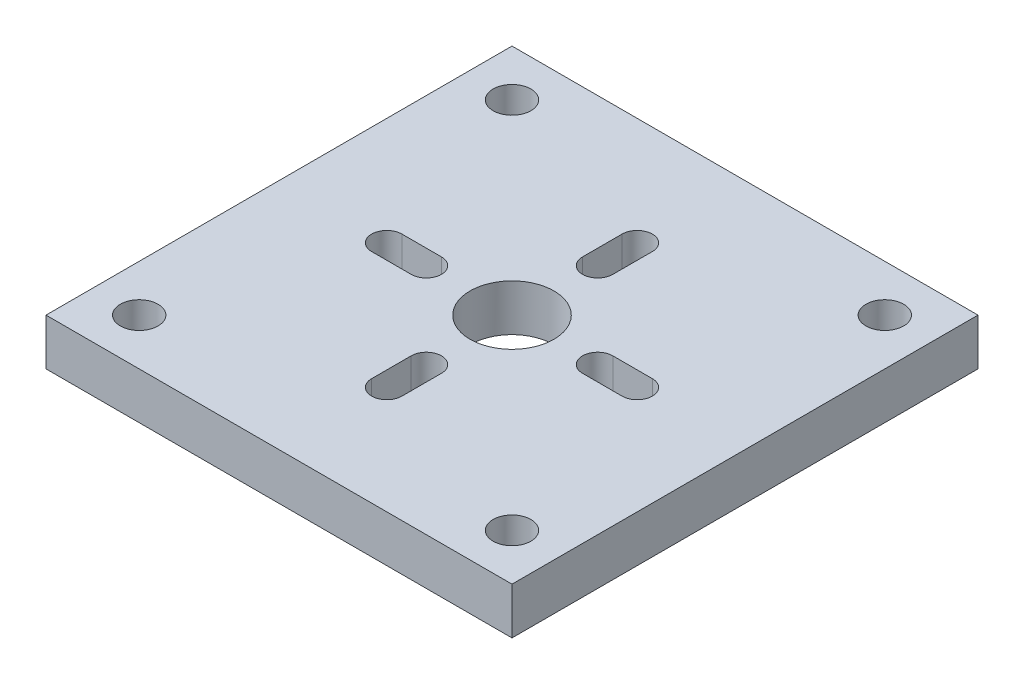
ISO-10303-21;
HEADER;
FILE_DESCRIPTION(('STEP AP214'),'2;1');
FILE_NAME('part.step','',(''),(''),'','','');
FILE_SCHEMA(('AUTOMOTIVE_DESIGN { 1 0 10303 214 1 1 1 1 }'));
ENDSEC;
DATA;
#1=APPLICATION_CONTEXT('core data for automotive mechanical design processes');
#2=APPLICATION_PROTOCOL_DEFINITION('international standard','automotive_design',2000,#1);
#3=PRODUCT_CONTEXT('',#1,'mechanical');
#4=PRODUCT('Part','Part','',(#3));
#5=PRODUCT_RELATED_PRODUCT_CATEGORY('part','',(#4));
#6=PRODUCT_DEFINITION_FORMATION('','',#4);
#7=PRODUCT_DEFINITION_CONTEXT('part definition',#1,'design');
#8=PRODUCT_DEFINITION('design','',#6,#7);
#9=PRODUCT_DEFINITION_SHAPE('','',#8);
#10=(LENGTH_UNIT() NAMED_UNIT(*) SI_UNIT(.MILLI.,.METRE.));
#11=(NAMED_UNIT(*) PLANE_ANGLE_UNIT() SI_UNIT($,.RADIAN.));
#12=(NAMED_UNIT(*) SI_UNIT($,.STERADIAN.) SOLID_ANGLE_UNIT());
#13=UNCERTAINTY_MEASURE_WITH_UNIT(LENGTH_MEASURE(1.E-05),#10,'distance_accuracy_value','');
#14=(GEOMETRIC_REPRESENTATION_CONTEXT(3) GLOBAL_UNCERTAINTY_ASSIGNED_CONTEXT((#13)) GLOBAL_UNIT_ASSIGNED_CONTEXT((#10,
#11,#12)) REPRESENTATION_CONTEXT('',''));
#15=CARTESIAN_POINT('',(0.,0.,0.));
#16=DIRECTION('',(0.,0.,1.));
#17=DIRECTION('',(1.,0.,0.));
#18=AXIS2_PLACEMENT_3D('',#15,#16,#17);
#19=CARTESIAN_POINT('',(50.,10.,-50.));
#20=DIRECTION('',(1.,0.,0.));
#21=DIRECTION('',(0.,0.,-1.));
#22=AXIS2_PLACEMENT_3D('',#19,#20,#21);
#23=PLANE('',#22);
#24=DIRECTION('',(0.,0.,1.));
#25=VECTOR('',#24,1.);
#26=CARTESIAN_POINT('',(50.,0.,-50.));
#27=LINE('',#26,#25);
#28=CARTESIAN_POINT('',(50.,0.,-50.));
#29=VERTEX_POINT('',#28);
#30=CARTESIAN_POINT('',(50.,0.,50.));
#31=VERTEX_POINT('',#30);
#32=EDGE_CURVE('E323',#29,#31,#27,.T.);
#33=ORIENTED_EDGE('',*,*,#32,.F.);
#34=DIRECTION('',(0.,-1.,0.));
#35=VECTOR('',#34,1.);
#36=CARTESIAN_POINT('',(50.,10.,-50.));
#37=LINE('',#36,#35);
#38=CARTESIAN_POINT('',(50.,10.,-50.));
#39=VERTEX_POINT('',#38);
#40=EDGE_CURVE('E11',#39,#29,#37,.T.);
#41=ORIENTED_EDGE('',*,*,#40,.F.);
#42=DIRECTION('',(0.,0.,1.));
#43=VECTOR('',#42,1.);
#44=CARTESIAN_POINT('',(50.,10.,-50.));
#45=LINE('',#44,#43);
#46=CARTESIAN_POINT('',(50.,10.,50.));
#47=VERTEX_POINT('',#46);
#48=EDGE_CURVE('E311',#39,#47,#45,.T.);
#49=ORIENTED_EDGE('',*,*,#48,.T.);
#50=DIRECTION('',(0.,-1.,0.));
#51=VECTOR('',#50,1.);
#52=CARTESIAN_POINT('',(50.,10.,50.));
#53=LINE('',#52,#51);
#54=EDGE_CURVE('E322',#47,#31,#53,.T.);
#55=ORIENTED_EDGE('',*,*,#54,.T.);
#56=EDGE_LOOP('',(#33,#41,#49,#55));
#57=FACE_BOUND('',#56,.T.);
#58=ADVANCED_FACE('F37',(#57),#23,.T.);
#59=CARTESIAN_POINT('',(50.,10.,-50.));
#60=DIRECTION('',(0.,0.,1.));
#61=DIRECTION('',(1.,0.,0.));
#62=AXIS2_PLACEMENT_3D('',#59,#60,#61);
#63=PLANE('',#62);
#64=DIRECTION('',(-1.,0.,0.));
#65=VECTOR('',#64,1.);
#66=CARTESIAN_POINT('',(50.,0.,-50.));
#67=LINE('',#66,#65);
#68=CARTESIAN_POINT('',(-50.,0.,-50.));
#69=VERTEX_POINT('',#68);
#70=EDGE_CURVE('E315',#29,#69,#67,.T.);
#71=ORIENTED_EDGE('',*,*,#70,.T.);
#72=DIRECTION('',(0.,-1.,0.));
#73=VECTOR('',#72,1.);
#74=CARTESIAN_POINT('',(-50.,10.,-50.));
#75=LINE('',#74,#73);
#76=CARTESIAN_POINT('',(-50.,10.,-50.));
#77=VERTEX_POINT('',#76);
#78=EDGE_CURVE('E45',#77,#69,#75,.T.);
#79=ORIENTED_EDGE('',*,*,#78,.F.);
#80=DIRECTION('',(-1.,0.,0.));
#81=VECTOR('',#80,1.);
#82=CARTESIAN_POINT('',(50.,10.,-50.));
#83=LINE('',#82,#81);
#84=EDGE_CURVE('E320',#39,#77,#83,.T.);
#85=ORIENTED_EDGE('',*,*,#84,.F.);
#86=ORIENTED_EDGE('',*,*,#40,.T.);
#87=EDGE_LOOP('',(#71,#79,#85,#86));
#88=FACE_BOUND('',#87,.T.);
#89=ADVANCED_FACE('F349',(#88),#63,.F.);
#90=CARTESIAN_POINT('',(-50.,10.,-50.));
#91=DIRECTION('',(1.,0.,0.));
#92=DIRECTION('',(0.,0.,-1.));
#93=AXIS2_PLACEMENT_3D('',#90,#91,#92);
#94=PLANE('',#93);
#95=DIRECTION('',(0.,0.,1.));
#96=VECTOR('',#95,1.);
#97=CARTESIAN_POINT('',(-50.,0.,-50.));
#98=LINE('',#97,#96);
#99=CARTESIAN_POINT('',(-50.,0.,50.));
#100=VERTEX_POINT('',#99);
#101=EDGE_CURVE('E329',#69,#100,#98,.T.);
#102=ORIENTED_EDGE('',*,*,#101,.T.);
#103=DIRECTION('',(0.,-1.,0.));
#104=VECTOR('',#103,1.);
#105=CARTESIAN_POINT('',(-50.,10.,50.));
#106=LINE('',#105,#104);
#107=CARTESIAN_POINT('',(-50.,10.,50.));
#108=VERTEX_POINT('',#107);
#109=EDGE_CURVE('E335',#108,#100,#106,.T.);
#110=ORIENTED_EDGE('',*,*,#109,.F.);
#111=DIRECTION('',(0.,0.,1.));
#112=VECTOR('',#111,1.);
#113=CARTESIAN_POINT('',(-50.,10.,-50.));
#114=LINE('',#113,#112);
#115=EDGE_CURVE('E318',#77,#108,#114,.T.);
#116=ORIENTED_EDGE('',*,*,#115,.F.);
#117=ORIENTED_EDGE('',*,*,#78,.T.);
#118=EDGE_LOOP('',(#102,#110,#116,#117));
#119=FACE_BOUND('',#118,.T.);
#120=ADVANCED_FACE('F353',(#119),#94,.F.);
#121=CARTESIAN_POINT('',(50.,10.,50.));
#122=DIRECTION('',(0.,0.,1.));
#123=DIRECTION('',(1.,0.,0.));
#124=AXIS2_PLACEMENT_3D('',#121,#122,#123);
#125=PLANE('',#124);
#126=DIRECTION('',(-1.,0.,0.));
#127=VECTOR('',#126,1.);
#128=CARTESIAN_POINT('',(50.,0.,50.));
#129=LINE('',#128,#127);
#130=EDGE_CURVE('E326',#31,#100,#129,.T.);
#131=ORIENTED_EDGE('',*,*,#130,.F.);
#132=ORIENTED_EDGE('',*,*,#54,.F.);
#133=DIRECTION('',(-1.,0.,0.));
#134=VECTOR('',#133,1.);
#135=CARTESIAN_POINT('',(50.,10.,50.));
#136=LINE('',#135,#134);
#137=EDGE_CURVE('E314',#47,#108,#136,.T.);
#138=ORIENTED_EDGE('',*,*,#137,.T.);
#139=ORIENTED_EDGE('',*,*,#109,.T.);
#140=EDGE_LOOP('',(#131,#132,#138,#139));
#141=FACE_BOUND('',#140,.T.);
#142=ADVANCED_FACE('F342',(#141),#125,.T.);
#143=CARTESIAN_POINT('',(0.,10.,0.));
#144=DIRECTION('',(0.,-1.,0.));
#145=DIRECTION('',(0.,0.,-1.));
#146=AXIS2_PLACEMENT_3D('',#143,#144,#145);
#147=PLANE('',#146);
#148=CARTESIAN_POINT('',(-40.,10.,-40.));
#149=DIRECTION('',(0.,1.,0.));
#150=DIRECTION('',(0.,0.,1.));
#151=AXIS2_PLACEMENT_3D('',#148,#149,#150);
#152=CIRCLE('',#151,4.05);
#153=CARTESIAN_POINT('',(-40.,10.,-35.95));
#154=VERTEX_POINT('',#153);
#155=EDGE_CURVE('E606',#154,#154,#152,.T.);
#156=ORIENTED_EDGE('',*,*,#155,.F.);
#157=EDGE_LOOP('',(#156));
#158=FACE_BOUND('',#157,.T.);
#159=CARTESIAN_POINT('',(40.,10.,40.));
#160=DIRECTION('',(0.,1.,0.));
#161=DIRECTION('',(0.,0.,1.));
#162=AXIS2_PLACEMENT_3D('',#159,#160,#161);
#163=CIRCLE('',#162,4.05);
#164=CARTESIAN_POINT('',(40.,10.,44.05));
#165=VERTEX_POINT('',#164);
#166=EDGE_CURVE('E611',#165,#165,#163,.T.);
#167=ORIENTED_EDGE('',*,*,#166,.F.);
#168=EDGE_LOOP('',(#167));
#169=FACE_BOUND('',#168,.T.);
#170=CARTESIAN_POINT('',(40.,10.,-40.));
#171=DIRECTION('',(0.,1.,0.));
#172=DIRECTION('',(0.,0.,1.));
#173=AXIS2_PLACEMENT_3D('',#170,#171,#172);
#174=CIRCLE('',#173,4.05);
#175=CARTESIAN_POINT('',(40.,10.,-35.95));
#176=VERTEX_POINT('',#175);
#177=EDGE_CURVE('E622',#176,#176,#174,.T.);
#178=ORIENTED_EDGE('',*,*,#177,.F.);
#179=EDGE_LOOP('',(#178));
#180=FACE_BOUND('',#179,.T.);
#181=CARTESIAN_POINT('',(-40.,10.,40.));
#182=DIRECTION('',(0.,1.,0.));
#183=DIRECTION('',(0.,0.,1.));
#184=AXIS2_PLACEMENT_3D('',#181,#182,#183);
#185=CIRCLE('',#184,4.05);
#186=CARTESIAN_POINT('',(-40.,10.,44.05));
#187=VERTEX_POINT('',#186);
#188=EDGE_CURVE('E281',#187,#187,#185,.T.);
#189=ORIENTED_EDGE('',*,*,#188,.F.);
#190=EDGE_LOOP('',(#189));
#191=FACE_BOUND('',#190,.T.);
#192=DIRECTION('',(0.,0.,-1.));
#193=VECTOR('',#192,1.);
#194=CARTESIAN_POINT('',(3.25,10.,26.8700576850888));
#195=LINE('',#194,#193);
#196=CARTESIAN_POINT('',(3.25,10.,26.8700576850888));
#197=VERTEX_POINT('',#196);
#198=CARTESIAN_POINT('',(3.25,10.,18.3847763108502));
#199=VERTEX_POINT('',#198);
#200=EDGE_CURVE('E198',#197,#199,#195,.T.);
#201=ORIENTED_EDGE('',*,*,#200,.F.);
#202=CARTESIAN_POINT('',(0.,10.,26.8700576850888));
#203=DIRECTION('',(0.,1.,0.));
#204=DIRECTION('',(0.,0.,-1.));
#205=AXIS2_PLACEMENT_3D('',#202,#203,#204);
#206=CIRCLE('',#205,3.25);
#207=CARTESIAN_POINT('',(-3.24999999999999,10.,26.8700576850888));
#208=VERTEX_POINT('',#207);
#209=EDGE_CURVE('E53',#208,#197,#206,.T.);
#210=ORIENTED_EDGE('',*,*,#209,.F.);
#211=DIRECTION('',(0.,0.,1.));
#212=VECTOR('',#211,1.);
#213=CARTESIAN_POINT('',(-3.24999999999999,10.,26.8700576850888));
#214=LINE('',#213,#212);
#215=CARTESIAN_POINT('',(-3.25,10.,18.3847763108502));
#216=VERTEX_POINT('',#215);
#217=EDGE_CURVE('E191',#216,#208,#214,.T.);
#218=ORIENTED_EDGE('',*,*,#217,.F.);
#219=CARTESIAN_POINT('',(0.,10.,18.3847763108502));
#220=DIRECTION('',(0.,1.,0.));
#221=DIRECTION('',(0.,0.,-1.));
#222=AXIS2_PLACEMENT_3D('',#219,#220,#221);
#223=CIRCLE('',#222,3.25);
#224=EDGE_CURVE('E205',#199,#216,#223,.T.);
#225=ORIENTED_EDGE('',*,*,#224,.F.);
#226=EDGE_LOOP('',(#201,#210,#218,#225));
#227=FACE_BOUND('',#226,.T.);
#228=DIRECTION('',(1.,0.,0.));
#229=VECTOR('',#228,1.);
#230=CARTESIAN_POINT('',(-26.8700576850888,10.,3.25));
#231=LINE('',#230,#229);
#232=CARTESIAN_POINT('',(-26.8700576850888,10.,3.25));
#233=VERTEX_POINT('',#232);
#234=CARTESIAN_POINT('',(-18.3847763108502,10.,3.25));
#235=VERTEX_POINT('',#234);
#236=EDGE_CURVE('E225',#233,#235,#231,.T.);
#237=ORIENTED_EDGE('',*,*,#236,.F.);
#238=CARTESIAN_POINT('',(-26.8700576850888,10.,0.));
#239=DIRECTION('',(0.,1.,0.));
#240=DIRECTION('',(0.,0.,-1.));
#241=AXIS2_PLACEMENT_3D('',#238,#239,#240);
#242=CIRCLE('',#241,3.25);
#243=CARTESIAN_POINT('',(-26.8700576850888,10.,-3.25));
#244=VERTEX_POINT('',#243);
#245=EDGE_CURVE('E61',#244,#233,#242,.T.);
#246=ORIENTED_EDGE('',*,*,#245,.F.);
#247=DIRECTION('',(-1.,0.,0.));
#248=VECTOR('',#247,1.);
#249=CARTESIAN_POINT('',(-26.8700576850888,10.,-3.25));
#250=LINE('',#249,#248);
#251=CARTESIAN_POINT('',(-18.3847763108502,10.,-3.25));
#252=VERTEX_POINT('',#251);
#253=EDGE_CURVE('E231',#252,#244,#250,.T.);
#254=ORIENTED_EDGE('',*,*,#253,.F.);
#255=CARTESIAN_POINT('',(-18.3847763108502,10.,0.));
#256=DIRECTION('',(0.,1.,0.));
#257=DIRECTION('',(0.,0.,-1.));
#258=AXIS2_PLACEMENT_3D('',#255,#256,#257);
#259=CIRCLE('',#258,3.25);
#260=EDGE_CURVE('E228',#235,#252,#259,.T.);
#261=ORIENTED_EDGE('',*,*,#260,.F.);
#262=EDGE_LOOP('',(#237,#246,#254,#261));
#263=FACE_BOUND('',#262,.T.);
#264=DIRECTION('',(0.,0.,1.));
#265=VECTOR('',#264,1.);
#266=CARTESIAN_POINT('',(-3.25,10.,-26.8700576850888));
#267=LINE('',#266,#265);
#268=CARTESIAN_POINT('',(-3.25,10.,-26.8700576850888));
#269=VERTEX_POINT('',#268);
#270=CARTESIAN_POINT('',(-3.25,10.,-18.3847763108502));
#271=VERTEX_POINT('',#270);
#272=EDGE_CURVE('E257',#269,#271,#267,.T.);
#273=ORIENTED_EDGE('',*,*,#272,.F.);
#274=CARTESIAN_POINT('',(0.,10.,-26.8700576850888));
#275=DIRECTION('',(0.,1.,0.));
#276=DIRECTION('',(0.,0.,-1.));
#277=AXIS2_PLACEMENT_3D('',#274,#275,#276);
#278=CIRCLE('',#277,3.25);
#279=CARTESIAN_POINT('',(3.25,10.,-26.8700576850888));
#280=VERTEX_POINT('',#279);
#281=EDGE_CURVE('E255',#280,#269,#278,.T.);
#282=ORIENTED_EDGE('',*,*,#281,.F.);
#283=DIRECTION('',(0.,0.,-1.));
#284=VECTOR('',#283,1.);
#285=CARTESIAN_POINT('',(3.25,10.,-26.8700576850888));
#286=LINE('',#285,#284);
#287=CARTESIAN_POINT('',(3.25,10.,-18.3847763108502));
#288=VERTEX_POINT('',#287);
#289=EDGE_CURVE('E263',#288,#280,#286,.T.);
#290=ORIENTED_EDGE('',*,*,#289,.F.);
#291=CARTESIAN_POINT('',(0.,10.,-18.3847763108502));
#292=DIRECTION('',(0.,1.,0.));
#293=DIRECTION('',(0.,0.,-1.));
#294=AXIS2_PLACEMENT_3D('',#291,#292,#293);
#295=CIRCLE('',#294,3.25);
#296=EDGE_CURVE('E260',#271,#288,#295,.T.);
#297=ORIENTED_EDGE('',*,*,#296,.F.);
#298=EDGE_LOOP('',(#273,#282,#290,#297));
#299=FACE_BOUND('',#298,.T.);
#300=DIRECTION('',(-1.,0.,0.));
#301=VECTOR('',#300,1.);
#302=CARTESIAN_POINT('',(26.8700576850888,10.,-3.25));
#303=LINE('',#302,#301);
#304=CARTESIAN_POINT('',(26.8700576850888,10.,-3.25));
#305=VERTEX_POINT('',#304);
#306=CARTESIAN_POINT('',(18.3847763108502,10.,-3.25));
#307=VERTEX_POINT('',#306);
#308=EDGE_CURVE('E289',#305,#307,#303,.T.);
#309=ORIENTED_EDGE('',*,*,#308,.F.);
#310=CARTESIAN_POINT('',(26.8700576850888,10.,0.));
#311=DIRECTION('',(0.,1.,0.));
#312=DIRECTION('',(0.,0.,-1.));
#313=AXIS2_PLACEMENT_3D('',#310,#311,#312);
#314=CIRCLE('',#313,3.25);
#315=CARTESIAN_POINT('',(26.8700576850888,10.,3.25));
#316=VERTEX_POINT('',#315);
#317=EDGE_CURVE('E287',#316,#305,#314,.T.);
#318=ORIENTED_EDGE('',*,*,#317,.F.);
#319=DIRECTION('',(1.,0.,0.));
#320=VECTOR('',#319,1.);
#321=CARTESIAN_POINT('',(26.8700576850888,10.,3.25));
#322=LINE('',#321,#320);
#323=CARTESIAN_POINT('',(18.3847763108502,10.,3.25));
#324=VERTEX_POINT('',#323);
#325=EDGE_CURVE('E295',#324,#316,#322,.T.);
#326=ORIENTED_EDGE('',*,*,#325,.F.);
#327=CARTESIAN_POINT('',(18.3847763108502,10.,0.));
#328=DIRECTION('',(0.,1.,0.));
#329=DIRECTION('',(0.,0.,-1.));
#330=AXIS2_PLACEMENT_3D('',#327,#328,#329);
#331=CIRCLE('',#330,3.25);
#332=EDGE_CURVE('E292',#307,#324,#331,.T.);
#333=ORIENTED_EDGE('',*,*,#332,.F.);
#334=EDGE_LOOP('',(#309,#318,#326,#333));
#335=FACE_BOUND('',#334,.T.);
#336=CARTESIAN_POINT('',(0.,10.,0.));
#337=DIRECTION('',(0.,1.,0.));
#338=DIRECTION('',(0.,0.,1.));
#339=AXIS2_PLACEMENT_3D('',#336,#337,#338);
#340=CIRCLE('',#339,9.);
#341=CARTESIAN_POINT('',(0.,10.,9.));
#342=VERTEX_POINT('',#341);
#343=EDGE_CURVE('E185',#342,#342,#340,.T.);
#344=ORIENTED_EDGE('',*,*,#343,.F.);
#345=EDGE_LOOP('',(#344));
#346=FACE_BOUND('',#345,.T.);
#347=ORIENTED_EDGE('',*,*,#48,.F.);
#348=ORIENTED_EDGE('',*,*,#84,.T.);
#349=ORIENTED_EDGE('',*,*,#115,.T.);
#350=ORIENTED_EDGE('',*,*,#137,.F.);
#351=EDGE_LOOP('',(#347,#348,#349,#350));
#352=FACE_BOUND('',#351,.T.);
#353=ADVANCED_FACE('F355',(#158,#169,#180,#191,#227,#263,#299,#335,#346,#352),#147,.F.);
#354=CARTESIAN_POINT('',(0.,0.,0.));
#355=DIRECTION('',(0.,-1.,0.));
#356=DIRECTION('',(0.,0.,-1.));
#357=AXIS2_PLACEMENT_3D('',#354,#355,#356);
#358=PLANE('',#357);
#359=CARTESIAN_POINT('',(-40.,0.,-40.));
#360=DIRECTION('',(0.,-1.,0.));
#361=DIRECTION('',(0.,0.,-1.));
#362=AXIS2_PLACEMENT_3D('',#359,#360,#361);
#363=CIRCLE('',#362,4.05);
#364=CARTESIAN_POINT('',(-40.,0.,-44.05));
#365=VERTEX_POINT('',#364);
#366=EDGE_CURVE('E604',#365,#365,#363,.F.);
#367=ORIENTED_EDGE('',*,*,#366,.T.);
#368=EDGE_LOOP('',(#367));
#369=FACE_BOUND('',#368,.T.);
#370=CARTESIAN_POINT('',(40.,0.,40.));
#371=DIRECTION('',(0.,-1.,0.));
#372=DIRECTION('',(0.,0.,-1.));
#373=AXIS2_PLACEMENT_3D('',#370,#371,#372);
#374=CIRCLE('',#373,4.05);
#375=CARTESIAN_POINT('',(40.,0.,35.95));
#376=VERTEX_POINT('',#375);
#377=EDGE_CURVE('E619',#376,#376,#374,.F.);
#378=ORIENTED_EDGE('',*,*,#377,.T.);
#379=EDGE_LOOP('',(#378));
#380=FACE_BOUND('',#379,.T.);
#381=CARTESIAN_POINT('',(40.,0.,-40.));
#382=DIRECTION('',(0.,-1.,0.));
#383=DIRECTION('',(0.,0.,-1.));
#384=AXIS2_PLACEMENT_3D('',#381,#382,#383);
#385=CIRCLE('',#384,4.05);
#386=CARTESIAN_POINT('',(40.,0.,-44.05));
#387=VERTEX_POINT('',#386);
#388=EDGE_CURVE('E614',#387,#387,#385,.F.);
#389=ORIENTED_EDGE('',*,*,#388,.T.);
#390=EDGE_LOOP('',(#389));
#391=FACE_BOUND('',#390,.T.);
#392=CARTESIAN_POINT('',(-40.,0.,40.));
#393=DIRECTION('',(0.,-1.,0.));
#394=DIRECTION('',(0.,0.,-1.));
#395=AXIS2_PLACEMENT_3D('',#392,#393,#394);
#396=CIRCLE('',#395,4.05);
#397=CARTESIAN_POINT('',(-40.,0.,35.95));
#398=VERTEX_POINT('',#397);
#399=EDGE_CURVE('E607',#398,#398,#396,.F.);
#400=ORIENTED_EDGE('',*,*,#399,.T.);
#401=EDGE_LOOP('',(#400));
#402=FACE_BOUND('',#401,.T.);
#403=CARTESIAN_POINT('',(0.,0.,26.8700576850888));
#404=DIRECTION('',(0.,-1.,0.));
#405=DIRECTION('',(0.,0.,-1.));
#406=AXIS2_PLACEMENT_3D('',#403,#404,#405);
#407=CIRCLE('',#406,3.25);
#408=CARTESIAN_POINT('',(-3.24999999999999,0.,26.8700576850888));
#409=VERTEX_POINT('',#408);
#410=CARTESIAN_POINT('',(3.25,0.,26.8700576850888));
#411=VERTEX_POINT('',#410);
#412=EDGE_CURVE('E189',#409,#411,#407,.F.);
#413=ORIENTED_EDGE('',*,*,#412,.T.);
#414=DIRECTION('',(0.,0.,-1.));
#415=VECTOR('',#414,1.);
#416=CARTESIAN_POINT('',(3.25,0.,26.8700576850888));
#417=LINE('',#416,#415);
#418=CARTESIAN_POINT('',(3.25,0.,18.3847763108502));
#419=VERTEX_POINT('',#418);
#420=EDGE_CURVE('E175',#411,#419,#417,.T.);
#421=ORIENTED_EDGE('',*,*,#420,.T.);
#422=CARTESIAN_POINT('',(0.,0.,18.3847763108502));
#423=DIRECTION('',(0.,-1.,0.));
#424=DIRECTION('',(0.,0.,-1.));
#425=AXIS2_PLACEMENT_3D('',#422,#423,#424);
#426=CIRCLE('',#425,3.25);
#427=CARTESIAN_POINT('',(-3.25,0.,18.3847763108502));
#428=VERTEX_POINT('',#427);
#429=EDGE_CURVE('E200',#419,#428,#426,.F.);
#430=ORIENTED_EDGE('',*,*,#429,.T.);
#431=DIRECTION('',(0.,0.,1.));
#432=VECTOR('',#431,1.);
#433=CARTESIAN_POINT('',(-3.24999999999999,0.,26.8700576850888));
#434=LINE('',#433,#432);
#435=EDGE_CURVE('E196',#428,#409,#434,.T.);
#436=ORIENTED_EDGE('',*,*,#435,.T.);
#437=EDGE_LOOP('',(#413,#421,#430,#436));
#438=FACE_BOUND('',#437,.T.);
#439=CARTESIAN_POINT('',(-26.8700576850888,0.,0.));
#440=DIRECTION('',(0.,-1.,0.));
#441=DIRECTION('',(0.,0.,-1.));
#442=AXIS2_PLACEMENT_3D('',#439,#440,#441);
#443=CIRCLE('',#442,3.25);
#444=CARTESIAN_POINT('',(-26.8700576850888,0.,-3.25));
#445=VERTEX_POINT('',#444);
#446=CARTESIAN_POINT('',(-26.8700576850888,0.,3.25));
#447=VERTEX_POINT('',#446);
#448=EDGE_CURVE('E221',#445,#447,#443,.F.);
#449=ORIENTED_EDGE('',*,*,#448,.T.);
#450=DIRECTION('',(1.,0.,0.));
#451=VECTOR('',#450,1.);
#452=CARTESIAN_POINT('',(-26.8700576850888,0.,3.25));
#453=LINE('',#452,#451);
#454=CARTESIAN_POINT('',(-18.3847763108502,0.,3.25));
#455=VERTEX_POINT('',#454);
#456=EDGE_CURVE('E237',#447,#455,#453,.T.);
#457=ORIENTED_EDGE('',*,*,#456,.T.);
#458=CARTESIAN_POINT('',(-18.3847763108502,0.,0.));
#459=DIRECTION('',(0.,-1.,0.));
#460=DIRECTION('',(0.,0.,-1.));
#461=AXIS2_PLACEMENT_3D('',#458,#459,#460);
#462=CIRCLE('',#461,3.25);
#463=CARTESIAN_POINT('',(-18.3847763108502,0.,-3.25));
#464=VERTEX_POINT('',#463);
#465=EDGE_CURVE('E214',#455,#464,#462,.F.);
#466=ORIENTED_EDGE('',*,*,#465,.T.);
#467=DIRECTION('',(-1.,0.,0.));
#468=VECTOR('',#467,1.);
#469=CARTESIAN_POINT('',(-26.8700576850888,0.,-3.25));
#470=LINE('',#469,#468);
#471=EDGE_CURVE('E217',#464,#445,#470,.T.);
#472=ORIENTED_EDGE('',*,*,#471,.T.);
#473=EDGE_LOOP('',(#449,#457,#466,#472));
#474=FACE_BOUND('',#473,.T.);
#475=CARTESIAN_POINT('',(0.,0.,-26.8700576850888));
#476=DIRECTION('',(0.,-1.,0.));
#477=DIRECTION('',(0.,0.,-1.));
#478=AXIS2_PLACEMENT_3D('',#475,#476,#477);
#479=CIRCLE('',#478,3.25);
#480=CARTESIAN_POINT('',(3.25,0.,-26.8700576850888));
#481=VERTEX_POINT('',#480);
#482=CARTESIAN_POINT('',(-3.25,0.,-26.8700576850888));
#483=VERTEX_POINT('',#482);
#484=EDGE_CURVE('E252',#481,#483,#479,.F.);
#485=ORIENTED_EDGE('',*,*,#484,.T.);
#486=DIRECTION('',(0.,0.,1.));
#487=VECTOR('',#486,1.);
#488=CARTESIAN_POINT('',(-3.25,0.,-26.8700576850888));
#489=LINE('',#488,#487);
#490=CARTESIAN_POINT('',(-3.25,0.,-18.3847763108502));
#491=VERTEX_POINT('',#490);
#492=EDGE_CURVE('E218',#483,#491,#489,.T.);
#493=ORIENTED_EDGE('',*,*,#492,.T.);
#494=CARTESIAN_POINT('',(0.,0.,-18.3847763108502));
#495=DIRECTION('',(0.,-1.,0.));
#496=DIRECTION('',(0.,0.,-1.));
#497=AXIS2_PLACEMENT_3D('',#494,#495,#496);
#498=CIRCLE('',#497,3.25);
#499=CARTESIAN_POINT('',(3.25,0.,-18.3847763108502));
#500=VERTEX_POINT('',#499);
#501=EDGE_CURVE('E245',#491,#500,#498,.F.);
#502=ORIENTED_EDGE('',*,*,#501,.T.);
#503=DIRECTION('',(0.,0.,-1.));
#504=VECTOR('',#503,1.);
#505=CARTESIAN_POINT('',(3.25,0.,-26.8700576850888));
#506=LINE('',#505,#504);
#507=EDGE_CURVE('E248',#500,#481,#506,.T.);
#508=ORIENTED_EDGE('',*,*,#507,.T.);
#509=EDGE_LOOP('',(#485,#493,#502,#508));
#510=FACE_BOUND('',#509,.T.);
#511=CARTESIAN_POINT('',(26.8700576850888,0.,0.));
#512=DIRECTION('',(0.,-1.,0.));
#513=DIRECTION('',(0.,0.,-1.));
#514=AXIS2_PLACEMENT_3D('',#511,#512,#513);
#515=CIRCLE('',#514,3.25);
#516=CARTESIAN_POINT('',(26.8700576850888,0.,3.25));
#517=VERTEX_POINT('',#516);
#518=CARTESIAN_POINT('',(26.8700576850888,0.,-3.25));
#519=VERTEX_POINT('',#518);
#520=EDGE_CURVE('E284',#517,#519,#515,.F.);
#521=ORIENTED_EDGE('',*,*,#520,.T.);
#522=DIRECTION('',(-1.,0.,0.));
#523=VECTOR('',#522,1.);
#524=CARTESIAN_POINT('',(26.8700576850888,0.,-3.25));
#525=LINE('',#524,#523);
#526=CARTESIAN_POINT('',(18.3847763108502,0.,-3.25));
#527=VERTEX_POINT('',#526);
#528=EDGE_CURVE('E249',#519,#527,#525,.T.);
#529=ORIENTED_EDGE('',*,*,#528,.T.);
#530=CARTESIAN_POINT('',(18.3847763108502,0.,0.));
#531=DIRECTION('',(0.,-1.,0.));
#532=DIRECTION('',(0.,0.,-1.));
#533=AXIS2_PLACEMENT_3D('',#530,#531,#532);
#534=CIRCLE('',#533,3.25);
#535=CARTESIAN_POINT('',(18.3847763108502,0.,3.25));
#536=VERTEX_POINT('',#535);
#537=EDGE_CURVE('E277',#527,#536,#534,.F.);
#538=ORIENTED_EDGE('',*,*,#537,.T.);
#539=DIRECTION('',(1.,0.,0.));
#540=VECTOR('',#539,1.);
#541=CARTESIAN_POINT('',(26.8700576850888,0.,3.25));
#542=LINE('',#541,#540);
#543=EDGE_CURVE('E280',#536,#517,#542,.T.);
#544=ORIENTED_EDGE('',*,*,#543,.T.);
#545=EDGE_LOOP('',(#521,#529,#538,#544));
#546=FACE_BOUND('',#545,.T.);
#547=CARTESIAN_POINT('',(0.,0.,0.));
#548=DIRECTION('',(0.,-1.,0.));
#549=DIRECTION('',(0.,0.,-1.));
#550=AXIS2_PLACEMENT_3D('',#547,#548,#549);
#551=CIRCLE('',#550,9.);
#552=CARTESIAN_POINT('',(0.,0.,-9.));
#553=VERTEX_POINT('',#552);
#554=EDGE_CURVE('E40',#553,#553,#551,.T.);
#555=ORIENTED_EDGE('',*,*,#554,.F.);
#556=EDGE_LOOP('',(#555));
#557=FACE_BOUND('',#556,.T.);
#558=ORIENTED_EDGE('',*,*,#32,.T.);
#559=ORIENTED_EDGE('',*,*,#130,.T.);
#560=ORIENTED_EDGE('',*,*,#101,.F.);
#561=ORIENTED_EDGE('',*,*,#70,.F.);
#562=EDGE_LOOP('',(#558,#559,#560,#561));
#563=FACE_BOUND('',#562,.T.);
#564=ADVANCED_FACE('F194',(#369,#380,#391,#402,#438,#474,#510,#546,#557,#563),#358,.T.);
#565=CARTESIAN_POINT('',(0.,-30.,0.));
#566=DIRECTION('',(0.,1.,0.));
#567=DIRECTION('',(0.,0.,1.));
#568=AXIS2_PLACEMENT_3D('',#565,#566,#567);
#569=CYLINDRICAL_SURFACE('',#568,9.);
#570=ORIENTED_EDGE('',*,*,#554,.T.);
#571=EDGE_LOOP('',(#570));
#572=FACE_BOUND('',#571,.T.);
#573=ORIENTED_EDGE('',*,*,#343,.T.);
#574=EDGE_LOOP('',(#573));
#575=FACE_BOUND('',#574,.T.);
#576=ADVANCED_FACE('F363',(#572,#575),#569,.F.);
#577=CARTESIAN_POINT('',(26.8700576850888,-0.000999999999999265,0.));
#578=DIRECTION('',(0.,1.,0.));
#579=DIRECTION('',(0.,0.,1.));
#580=AXIS2_PLACEMENT_3D('',#577,#578,#579);
#581=CYLINDRICAL_SURFACE('',#580,3.25);
#582=DIRECTION('',(0.,1.,0.));
#583=VECTOR('',#582,1.);
#584=CARTESIAN_POINT('',(26.8700576850888,-0.000999999999999265,3.25));
#585=LINE('',#584,#583);
#586=EDGE_CURVE('E299',#517,#316,#585,.T.);
#587=ORIENTED_EDGE('',*,*,#586,.T.);
#588=ORIENTED_EDGE('',*,*,#317,.T.);
#589=DIRECTION('',(0.,1.,0.));
#590=VECTOR('',#589,1.);
#591=CARTESIAN_POINT('',(26.8700576850888,-0.000999999999999265,-3.25));
#592=LINE('',#591,#590);
#593=EDGE_CURVE('E298',#519,#305,#592,.T.);
#594=ORIENTED_EDGE('',*,*,#593,.F.);
#595=ORIENTED_EDGE('',*,*,#520,.F.);
#596=EDGE_LOOP('',(#587,#588,#594,#595));
#597=FACE_BOUND('',#596,.T.);
#598=ADVANCED_FACE('F394',(#597),#581,.F.);
#599=CARTESIAN_POINT('',(26.8700576850888,-0.000999999999999265,3.25));
#600=DIRECTION('',(0.,0.,1.));
#601=DIRECTION('',(1.,0.,0.));
#602=AXIS2_PLACEMENT_3D('',#599,#600,#601);
#603=PLANE('',#602);
#604=DIRECTION('',(0.,1.,0.));
#605=VECTOR('',#604,1.);
#606=CARTESIAN_POINT('',(18.3847763108502,-0.000999999999999265,3.25));
#607=LINE('',#606,#605);
#608=EDGE_CURVE('E301',#536,#324,#607,.T.);
#609=ORIENTED_EDGE('',*,*,#608,.T.);
#610=ORIENTED_EDGE('',*,*,#325,.T.);
#611=ORIENTED_EDGE('',*,*,#586,.F.);
#612=ORIENTED_EDGE('',*,*,#543,.F.);
#613=EDGE_LOOP('',(#609,#610,#611,#612));
#614=FACE_BOUND('',#613,.T.);
#615=ADVANCED_FACE('F404',(#614),#603,.F.);
#616=CARTESIAN_POINT('',(18.3847763108502,-0.000999999999999265,0.));
#617=DIRECTION('',(0.,1.,0.));
#618=DIRECTION('',(0.,0.,1.));
#619=AXIS2_PLACEMENT_3D('',#616,#617,#618);
#620=CYLINDRICAL_SURFACE('',#619,3.25);
#621=DIRECTION('',(0.,1.,0.));
#622=VECTOR('',#621,1.);
#623=CARTESIAN_POINT('',(18.3847763108502,-0.000999999999999265,-3.25));
#624=LINE('',#623,#622);
#625=EDGE_CURVE('E303',#527,#307,#624,.T.);
#626=ORIENTED_EDGE('',*,*,#625,.T.);
#627=ORIENTED_EDGE('',*,*,#332,.T.);
#628=ORIENTED_EDGE('',*,*,#608,.F.);
#629=ORIENTED_EDGE('',*,*,#537,.F.);
#630=EDGE_LOOP('',(#626,#627,#628,#629));
#631=FACE_BOUND('',#630,.T.);
#632=ADVANCED_FACE('F414',(#631),#620,.F.);
#633=CARTESIAN_POINT('',(26.8700576850888,-0.000999999999999265,-3.25));
#634=DIRECTION('',(0.,0.,-1.));
#635=DIRECTION('',(-1.,0.,0.));
#636=AXIS2_PLACEMENT_3D('',#633,#634,#635);
#637=PLANE('',#636);
#638=ORIENTED_EDGE('',*,*,#593,.T.);
#639=ORIENTED_EDGE('',*,*,#308,.T.);
#640=ORIENTED_EDGE('',*,*,#625,.F.);
#641=ORIENTED_EDGE('',*,*,#528,.F.);
#642=EDGE_LOOP('',(#638,#639,#640,#641));
#643=FACE_BOUND('',#642,.T.);
#644=ADVANCED_FACE('F424',(#643),#637,.F.);
#645=CARTESIAN_POINT('',(0.,-0.000999999999999265,-26.8700576850888));
#646=DIRECTION('',(0.,1.,0.));
#647=DIRECTION('',(0.,0.,1.));
#648=AXIS2_PLACEMENT_3D('',#645,#646,#647);
#649=CYLINDRICAL_SURFACE('',#648,3.25);
#650=DIRECTION('',(0.,1.,0.));
#651=VECTOR('',#650,1.);
#652=CARTESIAN_POINT('',(3.25,-0.000999999999999265,-26.8700576850888));
#653=LINE('',#652,#651);
#654=EDGE_CURVE('E267',#481,#280,#653,.T.);
#655=ORIENTED_EDGE('',*,*,#654,.T.);
#656=ORIENTED_EDGE('',*,*,#281,.T.);
#657=DIRECTION('',(0.,1.,0.));
#658=VECTOR('',#657,1.);
#659=CARTESIAN_POINT('',(-3.25,-0.000999999999999265,-26.8700576850888));
#660=LINE('',#659,#658);
#661=EDGE_CURVE('E266',#483,#269,#660,.T.);
#662=ORIENTED_EDGE('',*,*,#661,.F.);
#663=ORIENTED_EDGE('',*,*,#484,.F.);
#664=EDGE_LOOP('',(#655,#656,#662,#663));
#665=FACE_BOUND('',#664,.T.);
#666=ADVANCED_FACE('F434',(#665),#649,.F.);
#667=CARTESIAN_POINT('',(3.25,-0.000999999999999265,-26.8700576850888));
#668=DIRECTION('',(1.,0.,0.));
#669=DIRECTION('',(0.,0.,-1.));
#670=AXIS2_PLACEMENT_3D('',#667,#668,#669);
#671=PLANE('',#670);
#672=DIRECTION('',(0.,1.,0.));
#673=VECTOR('',#672,1.);
#674=CARTESIAN_POINT('',(3.25,-0.000999999999999265,-18.3847763108502));
#675=LINE('',#674,#673);
#676=EDGE_CURVE('E269',#500,#288,#675,.T.);
#677=ORIENTED_EDGE('',*,*,#676,.T.);
#678=ORIENTED_EDGE('',*,*,#289,.T.);
#679=ORIENTED_EDGE('',*,*,#654,.F.);
#680=ORIENTED_EDGE('',*,*,#507,.F.);
#681=EDGE_LOOP('',(#677,#678,#679,#680));
#682=FACE_BOUND('',#681,.T.);
#683=ADVANCED_FACE('F444',(#682),#671,.F.);
#684=CARTESIAN_POINT('',(0.,-0.000999999999999265,-18.3847763108502));
#685=DIRECTION('',(0.,1.,0.));
#686=DIRECTION('',(0.,0.,1.));
#687=AXIS2_PLACEMENT_3D('',#684,#685,#686);
#688=CYLINDRICAL_SURFACE('',#687,3.25);
#689=DIRECTION('',(0.,1.,0.));
#690=VECTOR('',#689,1.);
#691=CARTESIAN_POINT('',(-3.25,-0.000999999999999265,-18.3847763108502));
#692=LINE('',#691,#690);
#693=EDGE_CURVE('E271',#491,#271,#692,.T.);
#694=ORIENTED_EDGE('',*,*,#693,.T.);
#695=ORIENTED_EDGE('',*,*,#296,.T.);
#696=ORIENTED_EDGE('',*,*,#676,.F.);
#697=ORIENTED_EDGE('',*,*,#501,.F.);
#698=EDGE_LOOP('',(#694,#695,#696,#697));
#699=FACE_BOUND('',#698,.T.);
#700=ADVANCED_FACE('F454',(#699),#688,.F.);
#701=CARTESIAN_POINT('',(-3.25,-0.000999999999999265,-26.8700576850888));
#702=DIRECTION('',(-1.,0.,0.));
#703=DIRECTION('',(0.,0.,1.));
#704=AXIS2_PLACEMENT_3D('',#701,#702,#703);
#705=PLANE('',#704);
#706=ORIENTED_EDGE('',*,*,#661,.T.);
#707=ORIENTED_EDGE('',*,*,#272,.T.);
#708=ORIENTED_EDGE('',*,*,#693,.F.);
#709=ORIENTED_EDGE('',*,*,#492,.F.);
#710=EDGE_LOOP('',(#706,#707,#708,#709));
#711=FACE_BOUND('',#710,.T.);
#712=ADVANCED_FACE('F464',(#711),#705,.F.);
#713=CARTESIAN_POINT('',(-26.8700576850888,-0.000999999999999265,0.));
#714=DIRECTION('',(0.,1.,0.));
#715=DIRECTION('',(0.,0.,1.));
#716=AXIS2_PLACEMENT_3D('',#713,#714,#715);
#717=CYLINDRICAL_SURFACE('',#716,3.25);
#718=DIRECTION('',(0.,1.,0.));
#719=VECTOR('',#718,1.);
#720=CARTESIAN_POINT('',(-26.8700576850888,-0.000999999999999265,-3.25));
#721=LINE('',#720,#719);
#722=EDGE_CURVE('E235',#445,#244,#721,.T.);
#723=ORIENTED_EDGE('',*,*,#722,.T.);
#724=ORIENTED_EDGE('',*,*,#245,.T.);
#725=DIRECTION('',(0.,1.,0.));
#726=VECTOR('',#725,1.);
#727=CARTESIAN_POINT('',(-26.8700576850888,-0.000999999999999265,3.25));
#728=LINE('',#727,#726);
#729=EDGE_CURVE('E234',#447,#233,#728,.T.);
#730=ORIENTED_EDGE('',*,*,#729,.F.);
#731=ORIENTED_EDGE('',*,*,#448,.F.);
#732=EDGE_LOOP('',(#723,#724,#730,#731));
#733=FACE_BOUND('',#732,.T.);
#734=ADVANCED_FACE('F474',(#733),#717,.F.);
#735=CARTESIAN_POINT('',(-26.8700576850888,-0.000999999999999265,-3.25));
#736=DIRECTION('',(0.,0.,-1.));
#737=DIRECTION('',(-1.,0.,0.));
#738=AXIS2_PLACEMENT_3D('',#735,#736,#737);
#739=PLANE('',#738);
#740=DIRECTION('',(0.,1.,0.));
#741=VECTOR('',#740,1.);
#742=CARTESIAN_POINT('',(-18.3847763108502,-0.000999999999999265,-3.25));
#743=LINE('',#742,#741);
#744=EDGE_CURVE('E238',#464,#252,#743,.T.);
#745=ORIENTED_EDGE('',*,*,#744,.T.);
#746=ORIENTED_EDGE('',*,*,#253,.T.);
#747=ORIENTED_EDGE('',*,*,#722,.F.);
#748=ORIENTED_EDGE('',*,*,#471,.F.);
#749=EDGE_LOOP('',(#745,#746,#747,#748));
#750=FACE_BOUND('',#749,.T.);
#751=ADVANCED_FACE('F484',(#750),#739,.F.);
#752=CARTESIAN_POINT('',(-18.3847763108502,-0.000999999999999265,0.));
#753=DIRECTION('',(0.,1.,0.));
#754=DIRECTION('',(0.,0.,1.));
#755=AXIS2_PLACEMENT_3D('',#752,#753,#754);
#756=CYLINDRICAL_SURFACE('',#755,3.25);
#757=DIRECTION('',(0.,1.,0.));
#758=VECTOR('',#757,1.);
#759=CARTESIAN_POINT('',(-18.3847763108502,-0.000999999999999265,3.25));
#760=LINE('',#759,#758);
#761=EDGE_CURVE('E240',#455,#235,#760,.T.);
#762=ORIENTED_EDGE('',*,*,#761,.T.);
#763=ORIENTED_EDGE('',*,*,#260,.T.);
#764=ORIENTED_EDGE('',*,*,#744,.F.);
#765=ORIENTED_EDGE('',*,*,#465,.F.);
#766=EDGE_LOOP('',(#762,#763,#764,#765));
#767=FACE_BOUND('',#766,.T.);
#768=ADVANCED_FACE('F493',(#767),#756,.F.);
#769=CARTESIAN_POINT('',(-26.8700576850888,-0.000999999999999265,3.25));
#770=DIRECTION('',(0.,0.,1.));
#771=DIRECTION('',(1.,0.,0.));
#772=AXIS2_PLACEMENT_3D('',#769,#770,#771);
#773=PLANE('',#772);
#774=ORIENTED_EDGE('',*,*,#729,.T.);
#775=ORIENTED_EDGE('',*,*,#236,.T.);
#776=ORIENTED_EDGE('',*,*,#761,.F.);
#777=ORIENTED_EDGE('',*,*,#456,.F.);
#778=EDGE_LOOP('',(#774,#775,#776,#777));
#779=FACE_BOUND('',#778,.T.);
#780=ADVANCED_FACE('F503',(#779),#773,.F.);
#781=CARTESIAN_POINT('',(0.,-0.000999999999999265,26.8700576850888));
#782=DIRECTION('',(0.,1.,0.));
#783=DIRECTION('',(0.,0.,1.));
#784=AXIS2_PLACEMENT_3D('',#781,#782,#783);
#785=CYLINDRICAL_SURFACE('',#784,3.25);
#786=DIRECTION('',(0.,1.,0.));
#787=VECTOR('',#786,1.);
#788=CARTESIAN_POINT('',(-3.24999999999999,-0.000999999999999265,26.8700576850888));
#789=LINE('',#788,#787);
#790=EDGE_CURVE('E186',#409,#208,#789,.T.);
#791=ORIENTED_EDGE('',*,*,#790,.T.);
#792=ORIENTED_EDGE('',*,*,#209,.T.);
#793=DIRECTION('',(0.,1.,0.));
#794=VECTOR('',#793,1.);
#795=CARTESIAN_POINT('',(3.25,-0.000999999999999265,26.8700576850888));
#796=LINE('',#795,#794);
#797=EDGE_CURVE('E178',#411,#197,#796,.T.);
#798=ORIENTED_EDGE('',*,*,#797,.F.);
#799=ORIENTED_EDGE('',*,*,#412,.F.);
#800=EDGE_LOOP('',(#791,#792,#798,#799));
#801=FACE_BOUND('',#800,.T.);
#802=ADVANCED_FACE('F188',(#801),#785,.F.);
#803=CARTESIAN_POINT('',(-3.24999999999999,-0.000999999999999265,26.8700576850888));
#804=DIRECTION('',(-1.,0.,0.));
#805=DIRECTION('',(0.,0.,1.));
#806=AXIS2_PLACEMENT_3D('',#803,#804,#805);
#807=PLANE('',#806);
#808=DIRECTION('',(0.,1.,0.));
#809=VECTOR('',#808,1.);
#810=CARTESIAN_POINT('',(-3.25,-0.000999999999999265,18.3847763108502));
#811=LINE('',#810,#809);
#812=EDGE_CURVE('E211',#428,#216,#811,.T.);
#813=ORIENTED_EDGE('',*,*,#812,.T.);
#814=ORIENTED_EDGE('',*,*,#217,.T.);
#815=ORIENTED_EDGE('',*,*,#790,.F.);
#816=ORIENTED_EDGE('',*,*,#435,.F.);
#817=EDGE_LOOP('',(#813,#814,#815,#816));
#818=FACE_BOUND('',#817,.T.);
#819=ADVANCED_FACE('F522',(#818),#807,.F.);
#820=CARTESIAN_POINT('',(0.,-0.000999999999999265,18.3847763108502));
#821=DIRECTION('',(0.,1.,0.));
#822=DIRECTION('',(0.,0.,1.));
#823=AXIS2_PLACEMENT_3D('',#820,#821,#822);
#824=CYLINDRICAL_SURFACE('',#823,3.25);
#825=DIRECTION('',(0.,1.,0.));
#826=VECTOR('',#825,1.);
#827=CARTESIAN_POINT('',(3.25,-0.000999999999999265,18.3847763108502));
#828=LINE('',#827,#826);
#829=EDGE_CURVE('E180',#419,#199,#828,.T.);
#830=ORIENTED_EDGE('',*,*,#829,.T.);
#831=ORIENTED_EDGE('',*,*,#224,.T.);
#832=ORIENTED_EDGE('',*,*,#812,.F.);
#833=ORIENTED_EDGE('',*,*,#429,.F.);
#834=EDGE_LOOP('',(#830,#831,#832,#833));
#835=FACE_BOUND('',#834,.T.);
#836=ADVANCED_FACE('F531',(#835),#824,.F.);
#837=CARTESIAN_POINT('',(3.25,-0.000999999999999265,26.8700576850888));
#838=DIRECTION('',(1.,0.,0.));
#839=DIRECTION('',(0.,0.,-1.));
#840=AXIS2_PLACEMENT_3D('',#837,#838,#839);
#841=PLANE('',#840);
#842=ORIENTED_EDGE('',*,*,#797,.T.);
#843=ORIENTED_EDGE('',*,*,#200,.T.);
#844=ORIENTED_EDGE('',*,*,#829,.F.);
#845=ORIENTED_EDGE('',*,*,#420,.F.);
#846=EDGE_LOOP('',(#842,#843,#844,#845));
#847=FACE_BOUND('',#846,.T.);
#848=ADVANCED_FACE('F176',(#847),#841,.F.);
#849=CARTESIAN_POINT('',(-40.,-0.000999999999999265,40.));
#850=DIRECTION('',(0.,1.,0.));
#851=DIRECTION('',(0.,0.,1.));
#852=AXIS2_PLACEMENT_3D('',#849,#850,#851);
#853=CYLINDRICAL_SURFACE('',#852,4.05);
#854=ORIENTED_EDGE('',*,*,#399,.F.);
#855=EDGE_LOOP('',(#854));
#856=FACE_BOUND('',#855,.T.);
#857=ORIENTED_EDGE('',*,*,#188,.T.);
#858=EDGE_LOOP('',(#857));
#859=FACE_BOUND('',#858,.T.);
#860=ADVANCED_FACE('F549',(#856,#859),#853,.F.);
#861=CARTESIAN_POINT('',(40.,-0.000999999999999265,-40.));
#862=DIRECTION('',(0.,1.,0.));
#863=DIRECTION('',(0.,0.,1.));
#864=AXIS2_PLACEMENT_3D('',#861,#862,#863);
#865=CYLINDRICAL_SURFACE('',#864,4.05);
#866=ORIENTED_EDGE('',*,*,#388,.F.);
#867=EDGE_LOOP('',(#866));
#868=FACE_BOUND('',#867,.T.);
#869=ORIENTED_EDGE('',*,*,#177,.T.);
#870=EDGE_LOOP('',(#869));
#871=FACE_BOUND('',#870,.T.);
#872=ADVANCED_FACE('F567',(#868,#871),#865,.F.);
#873=CARTESIAN_POINT('',(40.,-0.000999999999999265,40.));
#874=DIRECTION('',(0.,1.,0.));
#875=DIRECTION('',(0.,0.,1.));
#876=AXIS2_PLACEMENT_3D('',#873,#874,#875);
#877=CYLINDRICAL_SURFACE('',#876,4.05);
#878=ORIENTED_EDGE('',*,*,#377,.F.);
#879=EDGE_LOOP('',(#878));
#880=FACE_BOUND('',#879,.T.);
#881=ORIENTED_EDGE('',*,*,#166,.T.);
#882=EDGE_LOOP('',(#881));
#883=FACE_BOUND('',#882,.T.);
#884=ADVANCED_FACE('F577',(#880,#883),#877,.F.);
#885=CARTESIAN_POINT('',(-40.,-0.000999999999999265,-40.));
#886=DIRECTION('',(0.,1.,0.));
#887=DIRECTION('',(0.,0.,1.));
#888=AXIS2_PLACEMENT_3D('',#885,#886,#887);
#889=CYLINDRICAL_SURFACE('',#888,4.05);
#890=ORIENTED_EDGE('',*,*,#366,.F.);
#891=EDGE_LOOP('',(#890));
#892=FACE_BOUND('',#891,.T.);
#893=ORIENTED_EDGE('',*,*,#155,.T.);
#894=EDGE_LOOP('',(#893));
#895=FACE_BOUND('',#894,.T.);
#896=ADVANCED_FACE('F587',(#892,#895),#889,.F.);
#897=CLOSED_SHELL('',(#58,#89,#120,#142,#353,#564,#576,#598,#615,#632,#644,#666,#683,#700,#712,
#734,#751,#768,#780,#802,#819,#836,#848,#860,#872,#884,#896));
#898=MANIFOLD_SOLID_BREP('B2',#897);
#899=ADVANCED_BREP_SHAPE_REPRESENTATION('',(#18,#898),#14);
#900=SHAPE_DEFINITION_REPRESENTATION(#9,#899);
ENDSEC;
END-ISO-10303-21;
